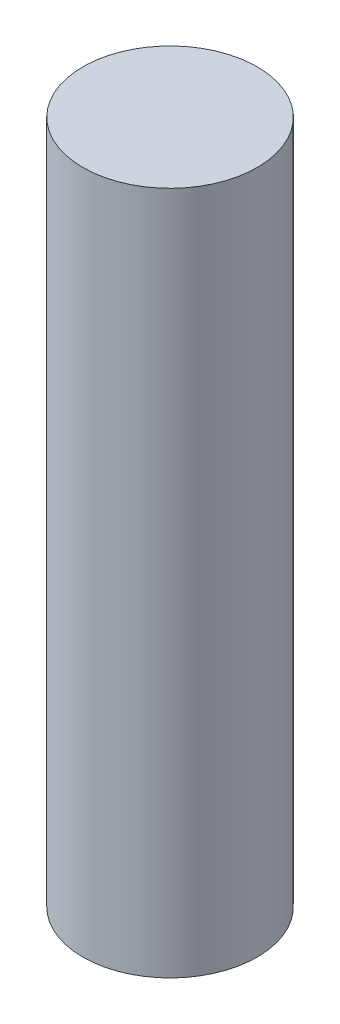
ISO-10303-21;
HEADER;
FILE_DESCRIPTION(('STEP AP214'),'2;1');
FILE_NAME('part.step','',(''),(''),'','','');
FILE_SCHEMA(('AUTOMOTIVE_DESIGN { 1 0 10303 214 1 1 1 1 }'));
ENDSEC;
DATA;
#1=APPLICATION_CONTEXT('core data for automotive mechanical design processes');
#2=APPLICATION_PROTOCOL_DEFINITION('international standard','automotive_design',2000,#1);
#3=PRODUCT_CONTEXT('',#1,'mechanical');
#4=PRODUCT('Part','Part','',(#3));
#5=PRODUCT_RELATED_PRODUCT_CATEGORY('part','',(#4));
#6=PRODUCT_DEFINITION_FORMATION('','',#4);
#7=PRODUCT_DEFINITION_CONTEXT('part definition',#1,'design');
#8=PRODUCT_DEFINITION('design','',#6,#7);
#9=PRODUCT_DEFINITION_SHAPE('','',#8);
#10=(LENGTH_UNIT() NAMED_UNIT(*) SI_UNIT(.MILLI.,.METRE.));
#11=(NAMED_UNIT(*) PLANE_ANGLE_UNIT() SI_UNIT($,.RADIAN.));
#12=(NAMED_UNIT(*) SI_UNIT($,.STERADIAN.) SOLID_ANGLE_UNIT());
#13=UNCERTAINTY_MEASURE_WITH_UNIT(LENGTH_MEASURE(1.E-05),#10,'distance_accuracy_value','');
#14=(GEOMETRIC_REPRESENTATION_CONTEXT(3) GLOBAL_UNCERTAINTY_ASSIGNED_CONTEXT((#13)) GLOBAL_UNIT_ASSIGNED_CONTEXT((#10,
#11,#12)) REPRESENTATION_CONTEXT('',''));
#15=CARTESIAN_POINT('',(0.,0.,0.));
#16=DIRECTION('',(0.,0.,1.));
#17=DIRECTION('',(1.,0.,0.));
#18=AXIS2_PLACEMENT_3D('',#15,#16,#17);
#19=CARTESIAN_POINT('',(0.,20.,0.));
#20=DIRECTION('',(0.,-1.,0.));
#21=DIRECTION('',(0.,0.,-1.));
#22=AXIS2_PLACEMENT_3D('',#19,#20,#21);
#23=CYLINDRICAL_SURFACE('',#22,2.55);
#24=CARTESIAN_POINT('',(0.,20.,0.));
#25=DIRECTION('',(0.,1.,0.));
#26=DIRECTION('',(0.,0.,1.));
#27=AXIS2_PLACEMENT_3D('',#24,#25,#26);
#28=CIRCLE('',#27,2.55);
#29=CARTESIAN_POINT('',(0.,20.,2.55));
#30=VERTEX_POINT('',#29);
#31=EDGE_CURVE('E10',#30,#30,#28,.T.);
#32=ORIENTED_EDGE('',*,*,#31,.F.);
#33=EDGE_LOOP('',(#32));
#34=FACE_BOUND('',#33,.T.);
#35=CARTESIAN_POINT('',(0.,0.,0.));
#36=DIRECTION('',(0.,1.,0.));
#37=DIRECTION('',(0.,0.,1.));
#38=AXIS2_PLACEMENT_3D('',#35,#36,#37);
#39=CIRCLE('',#38,2.55);
#40=CARTESIAN_POINT('',(0.,0.,2.55));
#41=VERTEX_POINT('',#40);
#42=EDGE_CURVE('E34',#41,#41,#39,.T.);
#43=ORIENTED_EDGE('',*,*,#42,.T.);
#44=EDGE_LOOP('',(#43));
#45=FACE_BOUND('',#44,.T.);
#46=ADVANCED_FACE('F31',(#34,#45),#23,.T.);
#47=CARTESIAN_POINT('',(0.,20.,0.));
#48=DIRECTION('',(0.,1.,0.));
#49=DIRECTION('',(0.,0.,1.));
#50=AXIS2_PLACEMENT_3D('',#47,#48,#49);
#51=PLANE('',#50);
#52=ORIENTED_EDGE('',*,*,#31,.T.);
#53=EDGE_LOOP('',(#52));
#54=FACE_BOUND('',#53,.T.);
#55=ADVANCED_FACE('F46',(#54),#51,.T.);
#56=CARTESIAN_POINT('',(0.,0.,0.));
#57=DIRECTION('',(0.,1.,0.));
#58=DIRECTION('',(0.,0.,1.));
#59=AXIS2_PLACEMENT_3D('',#56,#57,#58);
#60=PLANE('',#59);
#61=ORIENTED_EDGE('',*,*,#42,.F.);
#62=EDGE_LOOP('',(#61));
#63=FACE_BOUND('',#62,.T.);
#64=ADVANCED_FACE('F44',(#63),#60,.F.);
#65=CLOSED_SHELL('',(#46,#55,#64));
#66=MANIFOLD_SOLID_BREP('B2',#65);
#67=ADVANCED_BREP_SHAPE_REPRESENTATION('',(#18,#66),#14);
#68=SHAPE_DEFINITION_REPRESENTATION(#9,#67);
ENDSEC;
END-ISO-10303-21;
